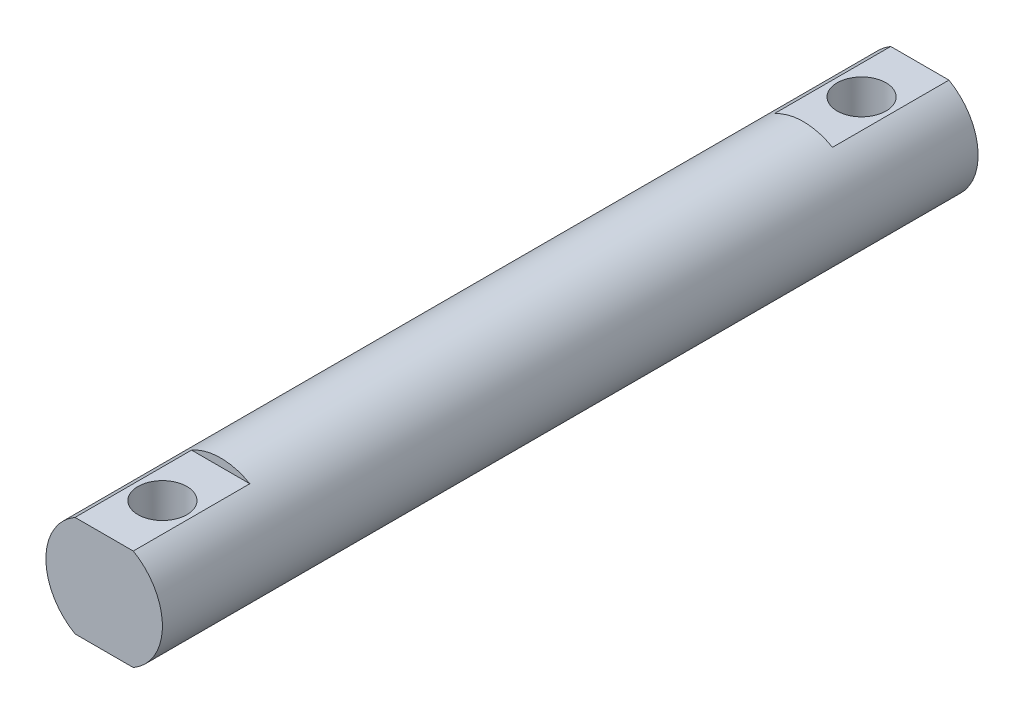
ISO-10303-21;
HEADER;
FILE_DESCRIPTION(('STEP AP214'),'2;1');
FILE_NAME('part.step','',(''),(''),'','','');
FILE_SCHEMA(('AUTOMOTIVE_DESIGN { 1 0 10303 214 1 1 1 1 }'));
ENDSEC;
DATA;
#1=APPLICATION_CONTEXT('core data for automotive mechanical design processes');
#2=APPLICATION_PROTOCOL_DEFINITION('international standard','automotive_design',2000,#1);
#3=PRODUCT_CONTEXT('',#1,'mechanical');
#4=PRODUCT('Part','Part','',(#3));
#5=PRODUCT_RELATED_PRODUCT_CATEGORY('part','',(#4));
#6=PRODUCT_DEFINITION_FORMATION('','',#4);
#7=PRODUCT_DEFINITION_CONTEXT('part definition',#1,'design');
#8=PRODUCT_DEFINITION('design','',#6,#7);
#9=PRODUCT_DEFINITION_SHAPE('','',#8);
#10=(LENGTH_UNIT() NAMED_UNIT(*) SI_UNIT(.MILLI.,.METRE.));
#11=(NAMED_UNIT(*) PLANE_ANGLE_UNIT() SI_UNIT($,.RADIAN.));
#12=(NAMED_UNIT(*) SI_UNIT($,.STERADIAN.) SOLID_ANGLE_UNIT());
#13=UNCERTAINTY_MEASURE_WITH_UNIT(LENGTH_MEASURE(1.E-05),#10,'distance_accuracy_value','');
#14=(GEOMETRIC_REPRESENTATION_CONTEXT(3) GLOBAL_UNCERTAINTY_ASSIGNED_CONTEXT((#13)) GLOBAL_UNIT_ASSIGNED_CONTEXT((#10,
#11,#12)) REPRESENTATION_CONTEXT('',''));
#15=CARTESIAN_POINT('',(0.,0.,0.));
#16=DIRECTION('',(0.,0.,1.));
#17=DIRECTION('',(1.,0.,0.));
#18=AXIS2_PLACEMENT_3D('',#15,#16,#17);
#19=CARTESIAN_POINT('',(0.,0.,70.));
#20=DIRECTION('',(0.,0.,-1.));
#21=DIRECTION('',(-1.,0.,0.));
#22=AXIS2_PLACEMENT_3D('',#19,#20,#21);
#23=CYLINDRICAL_SURFACE('',#22,5.);
#24=CARTESIAN_POINT('',(0.,0.,70.));
#25=DIRECTION('',(0.,0.,1.));
#26=DIRECTION('',(1.,0.,0.));
#27=AXIS2_PLACEMENT_3D('',#24,#25,#26);
#28=CIRCLE('',#27,5.);
#29=CARTESIAN_POINT('',(-2.5,4.33012701892219,70.));
#30=VERTEX_POINT('',#29);
#31=CARTESIAN_POINT('',(-2.5,-4.33012701892219,70.));
#32=VERTEX_POINT('',#31);
#33=EDGE_CURVE('E175',#30,#32,#28,.T.);
#34=ORIENTED_EDGE('',*,*,#33,.F.);
#35=DIRECTION('',(0.,0.,1.));
#36=VECTOR('',#35,1.);
#37=CARTESIAN_POINT('',(-2.5,4.33012701892219,60.));
#38=LINE('',#37,#36);
#39=CARTESIAN_POINT('',(-2.5,4.33012701892219,60.));
#40=VERTEX_POINT('',#39);
#41=EDGE_CURVE('E145',#40,#30,#38,.T.);
#42=ORIENTED_EDGE('',*,*,#41,.F.);
#43=CARTESIAN_POINT('',(0.,0.,60.));
#44=DIRECTION('',(0.,0.,1.));
#45=DIRECTION('',(1.,0.,0.));
#46=AXIS2_PLACEMENT_3D('',#43,#44,#45);
#47=CIRCLE('',#46,5.);
#48=CARTESIAN_POINT('',(2.5,4.33012701892219,60.));
#49=VERTEX_POINT('',#48);
#50=EDGE_CURVE('E190',#49,#40,#47,.T.);
#51=ORIENTED_EDGE('',*,*,#50,.F.);
#52=DIRECTION('',(0.,0.,1.));
#53=VECTOR('',#52,1.);
#54=CARTESIAN_POINT('',(2.5,4.33012701892219,60.));
#55=LINE('',#54,#53);
#56=CARTESIAN_POINT('',(2.5,4.33012701892219,70.));
#57=VERTEX_POINT('',#56);
#58=EDGE_CURVE('E150',#49,#57,#55,.T.);
#59=ORIENTED_EDGE('',*,*,#58,.T.);
#60=CARTESIAN_POINT('',(2.5,-4.33012701892219,70.));
#61=VERTEX_POINT('',#60);
#62=EDGE_CURVE('E171',#61,#57,#28,.T.);
#63=ORIENTED_EDGE('',*,*,#62,.F.);
#64=DIRECTION('',(0.,0.,1.));
#65=VECTOR('',#64,1.);
#66=CARTESIAN_POINT('',(2.5,-4.33012701892219,60.));
#67=LINE('',#66,#65);
#68=CARTESIAN_POINT('',(2.5,-4.33012701892219,60.));
#69=VERTEX_POINT('',#68);
#70=EDGE_CURVE('E157',#69,#61,#67,.T.);
#71=ORIENTED_EDGE('',*,*,#70,.F.);
#72=CARTESIAN_POINT('',(0.,0.,60.));
#73=DIRECTION('',(0.,0.,-1.));
#74=DIRECTION('',(-1.,0.,0.));
#75=AXIS2_PLACEMENT_3D('',#72,#73,#74);
#76=CIRCLE('',#75,5.);
#77=CARTESIAN_POINT('',(-2.5,-4.33012701892219,60.));
#78=VERTEX_POINT('',#77);
#79=EDGE_CURVE('E186',#69,#78,#76,.T.);
#80=ORIENTED_EDGE('',*,*,#79,.T.);
#81=DIRECTION('',(0.,0.,1.));
#82=VECTOR('',#81,1.);
#83=CARTESIAN_POINT('',(-2.5,-4.33012701892219,60.));
#84=LINE('',#83,#82);
#85=EDGE_CURVE('E161',#78,#32,#84,.T.);
#86=ORIENTED_EDGE('',*,*,#85,.T.);
#87=EDGE_LOOP('',(#34,#42,#51,#59,#63,#71,#80,#86));
#88=FACE_BOUND('',#87,.T.);
#89=CARTESIAN_POINT('',(0.,0.,10.));
#90=DIRECTION('',(0.,0.,-1.));
#91=DIRECTION('',(-1.,0.,0.));
#92=AXIS2_PLACEMENT_3D('',#89,#90,#91);
#93=CIRCLE('',#92,5.);
#94=CARTESIAN_POINT('',(-2.5,4.33012701892219,10.));
#95=VERTEX_POINT('',#94);
#96=CARTESIAN_POINT('',(2.5,4.33012701892219,10.));
#97=VERTEX_POINT('',#96);
#98=EDGE_CURVE('E11',#95,#97,#93,.T.);
#99=ORIENTED_EDGE('',*,*,#98,.F.);
#100=DIRECTION('',(0.,0.,-1.));
#101=VECTOR('',#100,1.);
#102=CARTESIAN_POINT('',(-2.5,4.33012701892219,10.));
#103=LINE('',#102,#101);
#104=CARTESIAN_POINT('',(-2.5,4.33012701892219,0.));
#105=VERTEX_POINT('',#104);
#106=EDGE_CURVE('E114',#95,#105,#103,.T.);
#107=ORIENTED_EDGE('',*,*,#106,.T.);
#108=CARTESIAN_POINT('',(0.,0.,0.));
#109=DIRECTION('',(0.,0.,1.));
#110=DIRECTION('',(1.,0.,0.));
#111=AXIS2_PLACEMENT_3D('',#108,#109,#110);
#112=CIRCLE('',#111,5.);
#113=CARTESIAN_POINT('',(-2.5,-4.33012701892219,0.));
#114=VERTEX_POINT('',#113);
#115=EDGE_CURVE('E176',#105,#114,#112,.T.);
#116=ORIENTED_EDGE('',*,*,#115,.T.);
#117=DIRECTION('',(0.,0.,-1.));
#118=VECTOR('',#117,1.);
#119=CARTESIAN_POINT('',(-2.5,-4.33012701892219,10.));
#120=LINE('',#119,#118);
#121=CARTESIAN_POINT('',(-2.5,-4.33012701892219,10.));
#122=VERTEX_POINT('',#121);
#123=EDGE_CURVE('E57',#122,#114,#120,.T.);
#124=ORIENTED_EDGE('',*,*,#123,.F.);
#125=CARTESIAN_POINT('',(0.,0.,10.));
#126=DIRECTION('',(0.,0.,-1.));
#127=DIRECTION('',(-1.,0.,0.));
#128=AXIS2_PLACEMENT_3D('',#125,#126,#127);
#129=CIRCLE('',#128,5.);
#130=CARTESIAN_POINT('',(2.5,-4.33012701892219,10.));
#131=VERTEX_POINT('',#130);
#132=EDGE_CURVE('E50',#131,#122,#129,.T.);
#133=ORIENTED_EDGE('',*,*,#132,.F.);
#134=DIRECTION('',(0.,0.,-1.));
#135=VECTOR('',#134,1.);
#136=CARTESIAN_POINT('',(2.5,-4.33012701892219,10.));
#137=LINE('',#136,#135);
#138=CARTESIAN_POINT('',(2.5,-4.33012701892219,0.));
#139=VERTEX_POINT('',#138);
#140=EDGE_CURVE('E132',#131,#139,#137,.T.);
#141=ORIENTED_EDGE('',*,*,#140,.T.);
#142=CARTESIAN_POINT('',(2.5,4.33012701892219,0.));
#143=VERTEX_POINT('',#142);
#144=EDGE_CURVE('E121',#139,#143,#112,.T.);
#145=ORIENTED_EDGE('',*,*,#144,.T.);
#146=DIRECTION('',(0.,0.,-1.));
#147=VECTOR('',#146,1.);
#148=CARTESIAN_POINT('',(2.5,4.33012701892219,10.));
#149=LINE('',#148,#147);
#150=EDGE_CURVE('E65',#97,#143,#149,.T.);
#151=ORIENTED_EDGE('',*,*,#150,.F.);
#152=EDGE_LOOP('',(#99,#107,#116,#124,#133,#141,#145,#151));
#153=FACE_BOUND('',#152,.T.);
#154=ADVANCED_FACE('F42',(#88,#153),#23,.T.);
#155=CARTESIAN_POINT('',(0.,0.,70.));
#156=DIRECTION('',(0.,0.,1.));
#157=DIRECTION('',(1.,0.,0.));
#158=AXIS2_PLACEMENT_3D('',#155,#156,#157);
#159=PLANE('',#158);
#160=DIRECTION('',(1.,0.,0.));
#161=VECTOR('',#160,1.);
#162=CARTESIAN_POINT('',(-2.5,4.33012701892219,70.));
#163=LINE('',#162,#161);
#164=EDGE_CURVE('E146',#30,#57,#163,.T.);
#165=ORIENTED_EDGE('',*,*,#164,.F.);
#166=ORIENTED_EDGE('',*,*,#33,.T.);
#167=DIRECTION('',(-1.,0.,0.));
#168=VECTOR('',#167,1.);
#169=CARTESIAN_POINT('',(-2.5,-4.33012701892219,70.));
#170=LINE('',#169,#168);
#171=EDGE_CURVE('E149',#61,#32,#170,.T.);
#172=ORIENTED_EDGE('',*,*,#171,.F.);
#173=ORIENTED_EDGE('',*,*,#62,.T.);
#174=EDGE_LOOP('',(#165,#166,#172,#173));
#175=FACE_BOUND('',#174,.T.);
#176=ADVANCED_FACE('F214',(#175),#159,.T.);
#177=CARTESIAN_POINT('',(0.,0.,0.));
#178=DIRECTION('',(0.,0.,1.));
#179=DIRECTION('',(1.,0.,0.));
#180=AXIS2_PLACEMENT_3D('',#177,#178,#179);
#181=PLANE('',#180);
#182=ORIENTED_EDGE('',*,*,#115,.F.);
#183=DIRECTION('',(-1.,0.,0.));
#184=VECTOR('',#183,1.);
#185=CARTESIAN_POINT('',(2.5,4.33012701892219,0.));
#186=LINE('',#185,#184);
#187=EDGE_CURVE('E116',#143,#105,#186,.T.);
#188=ORIENTED_EDGE('',*,*,#187,.F.);
#189=ORIENTED_EDGE('',*,*,#144,.F.);
#190=DIRECTION('',(1.,0.,0.));
#191=VECTOR('',#190,1.);
#192=CARTESIAN_POINT('',(2.5,-4.33012701892219,0.));
#193=LINE('',#192,#191);
#194=EDGE_CURVE('E135',#114,#139,#193,.T.);
#195=ORIENTED_EDGE('',*,*,#194,.F.);
#196=EDGE_LOOP('',(#182,#188,#189,#195));
#197=FACE_BOUND('',#196,.T.);
#198=ADVANCED_FACE('F227',(#197),#181,.F.);
#199=CARTESIAN_POINT('',(0.,0.,60.));
#200=DIRECTION('',(0.,0.,-1.));
#201=DIRECTION('',(-1.,0.,0.));
#202=AXIS2_PLACEMENT_3D('',#199,#200,#201);
#203=PLANE('',#202);
#204=DIRECTION('',(-1.,0.,0.));
#205=VECTOR('',#204,1.);
#206=CARTESIAN_POINT('',(-2.5,-4.33012701892219,60.));
#207=LINE('',#206,#205);
#208=EDGE_CURVE('E160',#69,#78,#207,.T.);
#209=ORIENTED_EDGE('',*,*,#208,.T.);
#210=ORIENTED_EDGE('',*,*,#79,.F.);
#211=EDGE_LOOP('',(#209,#210));
#212=FACE_BOUND('',#211,.T.);
#213=ADVANCED_FACE('F225',(#212),#203,.F.);
#214=CARTESIAN_POINT('',(-2.5,-4.33012701892219,60.));
#215=DIRECTION('',(0.,1.,0.));
#216=DIRECTION('',(0.,0.,1.));
#217=AXIS2_PLACEMENT_3D('',#214,#215,#216);
#218=PLANE('',#217);
#219=ORIENTED_EDGE('',*,*,#171,.T.);
#220=ORIENTED_EDGE('',*,*,#85,.F.);
#221=ORIENTED_EDGE('',*,*,#208,.F.);
#222=ORIENTED_EDGE('',*,*,#70,.T.);
#223=EDGE_LOOP('',(#219,#220,#221,#222));
#224=FACE_BOUND('',#223,.T.);
#225=CARTESIAN_POINT('',(0.,-4.33012701892219,65.));
#226=DIRECTION('',(0.,1.,0.));
#227=DIRECTION('',(0.,0.,1.));
#228=AXIS2_PLACEMENT_3D('',#225,#226,#227);
#229=CIRCLE('',#228,2.1);
#230=CARTESIAN_POINT('',(0.,-4.33012701892219,67.1));
#231=VERTEX_POINT('',#230);
#232=EDGE_CURVE('E154',#231,#231,#229,.F.);
#233=ORIENTED_EDGE('',*,*,#232,.F.);
#234=EDGE_LOOP('',(#233));
#235=FACE_BOUND('',#234,.T.);
#236=ADVANCED_FACE('F222',(#224,#235),#218,.F.);
#237=CARTESIAN_POINT('',(0.,0.,60.));
#238=DIRECTION('',(0.,0.,1.));
#239=DIRECTION('',(1.,0.,0.));
#240=AXIS2_PLACEMENT_3D('',#237,#238,#239);
#241=PLANE('',#240);
#242=ORIENTED_EDGE('',*,*,#50,.T.);
#243=DIRECTION('',(1.,0.,0.));
#244=VECTOR('',#243,1.);
#245=CARTESIAN_POINT('',(-2.5,4.33012701892219,60.));
#246=LINE('',#245,#244);
#247=EDGE_CURVE('E141',#40,#49,#246,.T.);
#248=ORIENTED_EDGE('',*,*,#247,.T.);
#249=EDGE_LOOP('',(#242,#248));
#250=FACE_BOUND('',#249,.T.);
#251=ADVANCED_FACE('F233',(#250),#241,.T.);
#252=CARTESIAN_POINT('',(-2.5,4.33012701892219,60.));
#253=DIRECTION('',(0.,-1.,0.));
#254=DIRECTION('',(0.,0.,-1.));
#255=AXIS2_PLACEMENT_3D('',#252,#253,#254);
#256=PLANE('',#255);
#257=ORIENTED_EDGE('',*,*,#164,.T.);
#258=ORIENTED_EDGE('',*,*,#58,.F.);
#259=ORIENTED_EDGE('',*,*,#247,.F.);
#260=ORIENTED_EDGE('',*,*,#41,.T.);
#261=EDGE_LOOP('',(#257,#258,#259,#260));
#262=FACE_BOUND('',#261,.T.);
#263=CARTESIAN_POINT('',(0.,4.33012701892219,65.));
#264=DIRECTION('',(0.,-1.,0.));
#265=DIRECTION('',(0.,0.,-1.));
#266=AXIS2_PLACEMENT_3D('',#263,#264,#265);
#267=CIRCLE('',#266,2.1);
#268=CARTESIAN_POINT('',(0.,4.33012701892219,62.9));
#269=VERTEX_POINT('',#268);
#270=EDGE_CURVE('E179',#269,#269,#267,.F.);
#271=ORIENTED_EDGE('',*,*,#270,.F.);
#272=EDGE_LOOP('',(#271));
#273=FACE_BOUND('',#272,.T.);
#274=ADVANCED_FACE('F246',(#262,#273),#256,.F.);
#275=CARTESIAN_POINT('',(0.,-5.,65.));
#276=DIRECTION('',(0.,1.,0.));
#277=DIRECTION('',(0.,0.,1.));
#278=AXIS2_PLACEMENT_3D('',#275,#276,#277);
#279=CYLINDRICAL_SURFACE('',#278,2.1);
#280=ORIENTED_EDGE('',*,*,#270,.T.);
#281=EDGE_LOOP('',(#280));
#282=FACE_BOUND('',#281,.T.);
#283=ORIENTED_EDGE('',*,*,#232,.T.);
#284=EDGE_LOOP('',(#283));
#285=FACE_BOUND('',#284,.T.);
#286=ADVANCED_FACE('F244',(#282,#285),#279,.F.);
#287=CARTESIAN_POINT('',(0.,0.,10.));
#288=DIRECTION('',(0.,0.,-1.));
#289=DIRECTION('',(-1.,0.,0.));
#290=AXIS2_PLACEMENT_3D('',#287,#288,#289);
#291=PLANE('',#290);
#292=ORIENTED_EDGE('',*,*,#132,.T.);
#293=DIRECTION('',(1.,0.,0.));
#294=VECTOR('',#293,1.);
#295=CARTESIAN_POINT('',(2.5,-4.33012701892219,10.));
#296=LINE('',#295,#294);
#297=EDGE_CURVE('E131',#122,#131,#296,.T.);
#298=ORIENTED_EDGE('',*,*,#297,.T.);
#299=EDGE_LOOP('',(#292,#298));
#300=FACE_BOUND('',#299,.T.);
#301=ADVANCED_FACE('F201',(#300),#291,.T.);
#302=CARTESIAN_POINT('',(2.5,-4.33012701892219,10.));
#303=DIRECTION('',(0.,1.,0.));
#304=DIRECTION('',(0.,0.,1.));
#305=AXIS2_PLACEMENT_3D('',#302,#303,#304);
#306=PLANE('',#305);
#307=ORIENTED_EDGE('',*,*,#194,.T.);
#308=ORIENTED_EDGE('',*,*,#140,.F.);
#309=ORIENTED_EDGE('',*,*,#297,.F.);
#310=ORIENTED_EDGE('',*,*,#123,.T.);
#311=EDGE_LOOP('',(#307,#308,#309,#310));
#312=FACE_BOUND('',#311,.T.);
#313=CARTESIAN_POINT('',(0.,-4.33012701892219,5.));
#314=DIRECTION('',(0.,1.,0.));
#315=DIRECTION('',(0.,0.,1.));
#316=AXIS2_PLACEMENT_3D('',#313,#314,#315);
#317=CIRCLE('',#316,2.1);
#318=CARTESIAN_POINT('',(0.,-4.33012701892219,7.1));
#319=VERTEX_POINT('',#318);
#320=EDGE_CURVE('E125',#319,#319,#317,.F.);
#321=ORIENTED_EDGE('',*,*,#320,.F.);
#322=EDGE_LOOP('',(#321));
#323=FACE_BOUND('',#322,.T.);
#324=ADVANCED_FACE('F202',(#312,#323),#306,.F.);
#325=CARTESIAN_POINT('',(0.,0.,10.));
#326=DIRECTION('',(0.,0.,-1.));
#327=DIRECTION('',(-1.,0.,0.));
#328=AXIS2_PLACEMENT_3D('',#325,#326,#327);
#329=PLANE('',#328);
#330=ORIENTED_EDGE('',*,*,#98,.T.);
#331=DIRECTION('',(-1.,0.,0.));
#332=VECTOR('',#331,1.);
#333=CARTESIAN_POINT('',(2.5,4.33012701892219,10.));
#334=LINE('',#333,#332);
#335=EDGE_CURVE('E109',#97,#95,#334,.T.);
#336=ORIENTED_EDGE('',*,*,#335,.T.);
#337=EDGE_LOOP('',(#330,#336));
#338=FACE_BOUND('',#337,.T.);
#339=ADVANCED_FACE('F108',(#338),#329,.T.);
#340=CARTESIAN_POINT('',(2.5,4.33012701892219,10.));
#341=DIRECTION('',(0.,-1.,0.));
#342=DIRECTION('',(0.,0.,-1.));
#343=AXIS2_PLACEMENT_3D('',#340,#341,#342);
#344=PLANE('',#343);
#345=ORIENTED_EDGE('',*,*,#187,.T.);
#346=ORIENTED_EDGE('',*,*,#106,.F.);
#347=ORIENTED_EDGE('',*,*,#335,.F.);
#348=ORIENTED_EDGE('',*,*,#150,.T.);
#349=EDGE_LOOP('',(#345,#346,#347,#348));
#350=FACE_BOUND('',#349,.T.);
#351=CARTESIAN_POINT('',(0.,4.33012701892219,5.));
#352=DIRECTION('',(0.,-1.,0.));
#353=DIRECTION('',(0.,0.,-1.));
#354=AXIS2_PLACEMENT_3D('',#351,#352,#353);
#355=CIRCLE('',#354,2.1);
#356=CARTESIAN_POINT('',(0.,4.33012701892219,2.9));
#357=VERTEX_POINT('',#356);
#358=EDGE_CURVE('E165',#357,#357,#355,.F.);
#359=ORIENTED_EDGE('',*,*,#358,.F.);
#360=EDGE_LOOP('',(#359));
#361=FACE_BOUND('',#360,.T.);
#362=ADVANCED_FACE('F112',(#350,#361),#344,.F.);
#363=CARTESIAN_POINT('',(0.,-5.,5.));
#364=DIRECTION('',(0.,1.,0.));
#365=DIRECTION('',(0.,0.,1.));
#366=AXIS2_PLACEMENT_3D('',#363,#364,#365);
#367=CYLINDRICAL_SURFACE('',#366,2.1);
#368=ORIENTED_EDGE('',*,*,#358,.T.);
#369=EDGE_LOOP('',(#368));
#370=FACE_BOUND('',#369,.T.);
#371=ORIENTED_EDGE('',*,*,#320,.T.);
#372=EDGE_LOOP('',(#371));
#373=FACE_BOUND('',#372,.T.);
#374=ADVANCED_FACE('F248',(#370,#373),#367,.F.);
#375=CLOSED_SHELL('',(#154,#176,#198,#213,#236,#251,#274,#286,#301,#324,#339,#362,#374));
#376=MANIFOLD_SOLID_BREP('B2',#375);
#377=ADVANCED_BREP_SHAPE_REPRESENTATION('',(#18,#376),#14);
#378=SHAPE_DEFINITION_REPRESENTATION(#9,#377);
ENDSEC;
END-ISO-10303-21;
